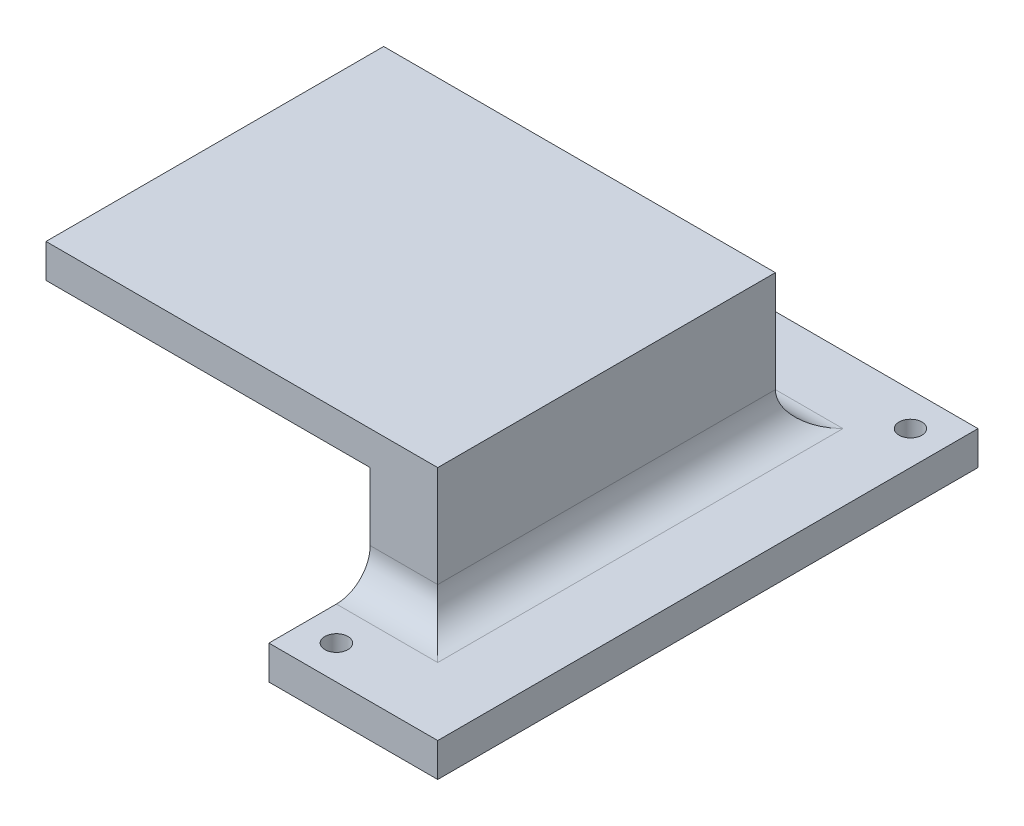
ISO-10303-21;
HEADER;
FILE_DESCRIPTION(('STEP AP214'),'2;1');
FILE_NAME('part.step','',(''),(''),'','','');
FILE_SCHEMA(('AUTOMOTIVE_DESIGN { 1 0 10303 214 1 1 1 1 }'));
ENDSEC;
DATA;
#1=APPLICATION_CONTEXT('core data for automotive mechanical design processes');
#2=APPLICATION_PROTOCOL_DEFINITION('international standard','automotive_design',2000,#1);
#3=PRODUCT_CONTEXT('',#1,'mechanical');
#4=PRODUCT('Part','Part','',(#3));
#5=PRODUCT_RELATED_PRODUCT_CATEGORY('part','',(#4));
#6=PRODUCT_DEFINITION_FORMATION('','',#4);
#7=PRODUCT_DEFINITION_CONTEXT('part definition',#1,'design');
#8=PRODUCT_DEFINITION('design','',#6,#7);
#9=PRODUCT_DEFINITION_SHAPE('','',#8);
#10=(LENGTH_UNIT() NAMED_UNIT(*) SI_UNIT(.MILLI.,.METRE.));
#11=(NAMED_UNIT(*) PLANE_ANGLE_UNIT() SI_UNIT($,.RADIAN.));
#12=(NAMED_UNIT(*) SI_UNIT($,.STERADIAN.) SOLID_ANGLE_UNIT());
#13=UNCERTAINTY_MEASURE_WITH_UNIT(LENGTH_MEASURE(1.E-05),#10,'distance_accuracy_value','');
#14=(GEOMETRIC_REPRESENTATION_CONTEXT(3) GLOBAL_UNCERTAINTY_ASSIGNED_CONTEXT((#13)) GLOBAL_UNIT_ASSIGNED_CONTEXT((#10,
#11,#12)) REPRESENTATION_CONTEXT('',''));
#15=CARTESIAN_POINT('',(0.,0.,0.));
#16=DIRECTION('',(0.,0.,1.));
#17=DIRECTION('',(1.,0.,0.));
#18=AXIS2_PLACEMENT_3D('',#15,#16,#17);
#19=CARTESIAN_POINT('',(24.,5.,0.));
#20=DIRECTION('',(-1.,0.,0.));
#21=DIRECTION('',(0.,0.,1.));
#22=AXIS2_PLACEMENT_3D('',#19,#20,#21);
#23=PLANE('',#22);
#24=DIRECTION('',(0.,0.,-1.));
#25=VECTOR('',#24,1.);
#26=CARTESIAN_POINT('',(24.,0.,0.));
#27=LINE('',#26,#25);
#28=CARTESIAN_POINT('',(24.,0.,-6.5));
#29=VERTEX_POINT('',#28);
#30=CARTESIAN_POINT('',(24.,0.,-27.5));
#31=VERTEX_POINT('',#30);
#32=EDGE_CURVE('E253',#29,#31,#27,.T.);
#33=ORIENTED_EDGE('',*,*,#32,.F.);
#34=DIRECTION('',(0.,-1.,0.));
#35=VECTOR('',#34,1.);
#36=CARTESIAN_POINT('',(24.,0.,-6.5));
#37=LINE('',#36,#35);
#38=CARTESIAN_POINT('',(24.,20.,-6.5));
#39=VERTEX_POINT('',#38);
#40=EDGE_CURVE('E182',#39,#29,#37,.T.);
#41=ORIENTED_EDGE('',*,*,#40,.F.);
#42=DIRECTION('',(0.,0.,1.));
#43=VECTOR('',#42,1.);
#44=CARTESIAN_POINT('',(24.,20.,0.));
#45=LINE('',#44,#43);
#46=CARTESIAN_POINT('',(24.,20.,-27.5));
#47=VERTEX_POINT('',#46);
#48=EDGE_CURVE('E212',#47,#39,#45,.T.);
#49=ORIENTED_EDGE('',*,*,#48,.F.);
#50=DIRECTION('',(0.,-1.,0.));
#51=VECTOR('',#50,1.);
#52=CARTESIAN_POINT('',(24.,5.,-27.5));
#53=LINE('',#52,#51);
#54=EDGE_CURVE('E282',#47,#31,#53,.T.);
#55=ORIENTED_EDGE('',*,*,#54,.T.);
#56=EDGE_LOOP('',(#33,#41,#49,#55));
#57=FACE_BOUND('',#56,.T.);
#58=ADVANCED_FACE('F35',(#57),#23,.T.);
#59=CARTESIAN_POINT('',(24.,20.,-1.5));
#60=VERTEX_POINT('',#59);
#61=CARTESIAN_POINT('',(24.,20.,12.5));
#62=VERTEX_POINT('',#61);
#63=EDGE_CURVE('E211',#60,#62,#45,.T.);
#64=ORIENTED_EDGE('',*,*,#63,.F.);
#65=DIRECTION('',(0.,1.,0.));
#66=VECTOR('',#65,1.);
#67=CARTESIAN_POINT('',(24.,0.,-1.5));
#68=LINE('',#67,#66);
#69=CARTESIAN_POINT('',(24.,0.,-1.5));
#70=VERTEX_POINT('',#69);
#71=EDGE_CURVE('E179',#70,#60,#68,.T.);
#72=ORIENTED_EDGE('',*,*,#71,.F.);
#73=CARTESIAN_POINT('',(24.,0.,27.5));
#74=VERTEX_POINT('',#73);
#75=EDGE_CURVE('E254',#74,#70,#27,.T.);
#76=ORIENTED_EDGE('',*,*,#75,.F.);
#77=DIRECTION('',(0.,-1.,0.));
#78=VECTOR('',#77,1.);
#79=CARTESIAN_POINT('',(24.,5.,27.5));
#80=LINE('',#79,#78);
#81=CARTESIAN_POINT('',(24.,5.,27.5));
#82=VERTEX_POINT('',#81);
#83=EDGE_CURVE('E280',#82,#74,#80,.T.);
#84=ORIENTED_EDGE('',*,*,#83,.F.);
#85=DIRECTION('',(0.,0.,-1.));
#86=VECTOR('',#85,1.);
#87=CARTESIAN_POINT('',(24.,5.,0.));
#88=LINE('',#87,#86);
#89=CARTESIAN_POINT('',(24.,5.,17.5));
#90=VERTEX_POINT('',#89);
#91=EDGE_CURVE('E229',#82,#90,#88,.T.);
#92=ORIENTED_EDGE('',*,*,#91,.T.);
#93=CARTESIAN_POINT('',(24.,10.,17.5));
#94=DIRECTION('',(-1.,0.,0.));
#95=DIRECTION('',(0.,0.,1.));
#96=AXIS2_PLACEMENT_3D('',#93,#94,#95);
#97=CIRCLE('',#96,5.);
#98=CARTESIAN_POINT('',(24.,10.,12.5));
#99=VERTEX_POINT('',#98);
#100=EDGE_CURVE('E11',#90,#99,#97,.F.);
#101=ORIENTED_EDGE('',*,*,#100,.T.);
#102=DIRECTION('',(0.,-1.,0.));
#103=VECTOR('',#102,1.);
#104=CARTESIAN_POINT('',(24.,20.,12.5));
#105=LINE('',#104,#103);
#106=EDGE_CURVE('E223',#62,#99,#105,.T.);
#107=ORIENTED_EDGE('',*,*,#106,.F.);
#108=EDGE_LOOP('',(#64,#72,#76,#84,#92,#101,#107));
#109=FACE_BOUND('',#108,.T.);
#110=ADVANCED_FACE('F334',(#109),#23,.T.);
#111=CARTESIAN_POINT('',(0.,20.,0.));
#112=DIRECTION('',(0.,1.,0.));
#113=DIRECTION('',(0.,0.,1.));
#114=AXIS2_PLACEMENT_3D('',#111,#112,#113);
#115=PLANE('',#114);
#116=DIRECTION('',(1.,0.,0.));
#117=VECTOR('',#116,1.);
#118=CARTESIAN_POINT('',(17.,20.,-6.5));
#119=LINE('',#118,#117);
#120=CARTESIAN_POINT('',(17.,20.,-6.5));
#121=VERTEX_POINT('',#120);
#122=EDGE_CURVE('E324',#121,#39,#119,.T.);
#123=ORIENTED_EDGE('',*,*,#122,.F.);
#124=DIRECTION('',(0.,0.,-1.));
#125=VECTOR('',#124,1.);
#126=CARTESIAN_POINT('',(17.,20.,-6.5));
#127=LINE('',#126,#125);
#128=CARTESIAN_POINT('',(17.,20.,-1.5));
#129=VERTEX_POINT('',#128);
#130=EDGE_CURVE('E176',#129,#121,#127,.T.);
#131=ORIENTED_EDGE('',*,*,#130,.F.);
#132=DIRECTION('',(1.,0.,0.));
#133=VECTOR('',#132,1.);
#134=CARTESIAN_POINT('',(17.,20.,-1.5));
#135=LINE('',#134,#133);
#136=EDGE_CURVE('E187',#129,#60,#135,.T.);
#137=ORIENTED_EDGE('',*,*,#136,.T.);
#138=ORIENTED_EDGE('',*,*,#63,.T.);
#139=DIRECTION('',(1.,0.,0.));
#140=VECTOR('',#139,1.);
#141=CARTESIAN_POINT('',(-24.,20.,12.5));
#142=LINE('',#141,#140);
#143=CARTESIAN_POINT('',(-24.,20.,12.5));
#144=VERTEX_POINT('',#143);
#145=EDGE_CURVE('E185',#144,#62,#142,.T.);
#146=ORIENTED_EDGE('',*,*,#145,.F.);
#147=DIRECTION('',(0.,0.,1.));
#148=VECTOR('',#147,1.);
#149=CARTESIAN_POINT('',(-24.,20.,-37.5));
#150=LINE('',#149,#148);
#151=CARTESIAN_POINT('',(-24.,20.,-27.5));
#152=VERTEX_POINT('',#151);
#153=EDGE_CURVE('E183',#152,#144,#150,.T.);
#154=ORIENTED_EDGE('',*,*,#153,.F.);
#155=DIRECTION('',(1.,0.,0.));
#156=VECTOR('',#155,1.);
#157=CARTESIAN_POINT('',(0.,20.,-27.5));
#158=LINE('',#157,#156);
#159=EDGE_CURVE('E208',#152,#47,#158,.T.);
#160=ORIENTED_EDGE('',*,*,#159,.T.);
#161=ORIENTED_EDGE('',*,*,#48,.T.);
#162=EDGE_LOOP('',(#123,#131,#137,#138,#146,#154,#160,#161));
#163=FACE_BOUND('',#162,.T.);
#164=ADVANCED_FACE('F331',(#163),#115,.F.);
#165=CARTESIAN_POINT('',(0.,5.,0.));
#166=DIRECTION('',(0.,1.,0.));
#167=DIRECTION('',(0.,0.,1.));
#168=AXIS2_PLACEMENT_3D('',#165,#166,#167);
#169=PLANE('',#168);
#170=DIRECTION('',(0.,0.,-1.));
#171=VECTOR('',#170,1.);
#172=CARTESIAN_POINT('',(-24.,5.,0.));
#173=LINE('',#172,#171);
#174=CARTESIAN_POINT('',(-24.,5.,-42.5));
#175=VERTEX_POINT('',#174);
#176=CARTESIAN_POINT('',(-24.,5.,-52.5));
#177=VERTEX_POINT('',#176);
#178=EDGE_CURVE('E239',#175,#177,#173,.T.);
#179=ORIENTED_EDGE('',*,*,#178,.F.);
#180=DIRECTION('',(1.,0.,0.));
#181=VECTOR('',#180,1.);
#182=CARTESIAN_POINT('',(34.,5.,-42.5));
#183=LINE('',#182,#181);
#184=CARTESIAN_POINT('',(39.,5.,-42.5));
#185=VERTEX_POINT('',#184);
#186=EDGE_CURVE('E289',#175,#185,#183,.T.);
#187=ORIENTED_EDGE('',*,*,#186,.T.);
#188=DIRECTION('',(0.,0.,-1.));
#189=VECTOR('',#188,1.);
#190=CARTESIAN_POINT('',(39.,5.,0.));
#191=LINE('',#190,#189);
#192=CARTESIAN_POINT('',(39.,5.,17.5));
#193=VERTEX_POINT('',#192);
#194=EDGE_CURVE('E285',#185,#193,#191,.F.);
#195=ORIENTED_EDGE('',*,*,#194,.T.);
#196=DIRECTION('',(-1.,0.,0.));
#197=VECTOR('',#196,1.);
#198=CARTESIAN_POINT('',(24.,5.,17.5));
#199=LINE('',#198,#197);
#200=EDGE_CURVE('E287',#193,#90,#199,.T.);
#201=ORIENTED_EDGE('',*,*,#200,.T.);
#202=ORIENTED_EDGE('',*,*,#91,.F.);
#203=DIRECTION('',(1.,0.,0.));
#204=VECTOR('',#203,1.);
#205=CARTESIAN_POINT('',(0.,5.,27.5));
#206=LINE('',#205,#204);
#207=CARTESIAN_POINT('',(49.,5.,27.5));
#208=VERTEX_POINT('',#207);
#209=EDGE_CURVE('E232',#82,#208,#206,.T.);
#210=ORIENTED_EDGE('',*,*,#209,.T.);
#211=DIRECTION('',(0.,0.,-1.));
#212=VECTOR('',#211,1.);
#213=CARTESIAN_POINT('',(49.,5.,0.));
#214=LINE('',#213,#212);
#215=CARTESIAN_POINT('',(49.,5.,-52.5));
#216=VERTEX_POINT('',#215);
#217=EDGE_CURVE('E234',#208,#216,#214,.T.);
#218=ORIENTED_EDGE('',*,*,#217,.T.);
#219=DIRECTION('',(1.,0.,0.));
#220=VECTOR('',#219,1.);
#221=CARTESIAN_POINT('',(0.,5.,-52.5));
#222=LINE('',#221,#220);
#223=EDGE_CURVE('E236',#177,#216,#222,.T.);
#224=ORIENTED_EDGE('',*,*,#223,.F.);
#225=EDGE_LOOP('',(#179,#187,#195,#201,#202,#210,#218,#224));
#226=FACE_BOUND('',#225,.T.);
#227=CARTESIAN_POINT('',(-19.,5.,-47.5));
#228=DIRECTION('',(0.,1.,0.));
#229=DIRECTION('',(0.,0.,1.));
#230=AXIS2_PLACEMENT_3D('',#227,#228,#229);
#231=CIRCLE('',#230,1.7);
#232=CARTESIAN_POINT('',(-19.,5.,-45.8));
#233=VERTEX_POINT('',#232);
#234=EDGE_CURVE('E226',#233,#233,#231,.T.);
#235=ORIENTED_EDGE('',*,*,#234,.F.);
#236=EDGE_LOOP('',(#235));
#237=FACE_BOUND('',#236,.T.);
#238=CARTESIAN_POINT('',(44.,5.,-47.5));
#239=DIRECTION('',(0.,1.,0.));
#240=DIRECTION('',(0.,0.,1.));
#241=AXIS2_PLACEMENT_3D('',#238,#239,#240);
#242=CIRCLE('',#241,1.7);
#243=CARTESIAN_POINT('',(44.,5.,-45.8));
#244=VERTEX_POINT('',#243);
#245=EDGE_CURVE('E241',#244,#244,#242,.T.);
#246=ORIENTED_EDGE('',*,*,#245,.F.);
#247=EDGE_LOOP('',(#246));
#248=FACE_BOUND('',#247,.T.);
#249=CARTESIAN_POINT('',(29.,5.,22.5));
#250=DIRECTION('',(0.,1.,0.));
#251=DIRECTION('',(0.,0.,1.));
#252=AXIS2_PLACEMENT_3D('',#249,#250,#251);
#253=CIRCLE('',#252,1.7);
#254=CARTESIAN_POINT('',(29.,5.,24.2));
#255=VERTEX_POINT('',#254);
#256=EDGE_CURVE('E244',#255,#255,#253,.T.);
#257=ORIENTED_EDGE('',*,*,#256,.F.);
#258=EDGE_LOOP('',(#257));
#259=FACE_BOUND('',#258,.T.);
#260=ADVANCED_FACE('F364',(#226,#237,#248,#259),#169,.T.);
#261=CARTESIAN_POINT('',(0.,5.,-27.5));
#262=DIRECTION('',(0.,0.,-1.));
#263=DIRECTION('',(-1.,0.,0.));
#264=AXIS2_PLACEMENT_3D('',#261,#262,#263);
#265=PLANE('',#264);
#266=DIRECTION('',(1.,0.,0.));
#267=VECTOR('',#266,1.);
#268=CARTESIAN_POINT('',(0.,0.,-27.5));
#269=LINE('',#268,#267);
#270=CARTESIAN_POINT('',(-24.,0.,-27.5));
#271=VERTEX_POINT('',#270);
#272=EDGE_CURVE('E250',#271,#31,#269,.T.);
#273=ORIENTED_EDGE('',*,*,#272,.T.);
#274=ORIENTED_EDGE('',*,*,#54,.F.);
#275=ORIENTED_EDGE('',*,*,#159,.F.);
#276=DIRECTION('',(0.,-1.,0.));
#277=VECTOR('',#276,1.);
#278=CARTESIAN_POINT('',(-24.,5.,-27.5));
#279=LINE('',#278,#277);
#280=EDGE_CURVE('E247',#152,#271,#279,.T.);
#281=ORIENTED_EDGE('',*,*,#280,.T.);
#282=EDGE_LOOP('',(#273,#274,#275,#281));
#283=FACE_BOUND('',#282,.T.);
#284=ADVANCED_FACE('F361',(#283),#265,.F.);
#285=CARTESIAN_POINT('',(0.,5.,27.5));
#286=DIRECTION('',(0.,0.,-1.));
#287=DIRECTION('',(-1.,0.,0.));
#288=AXIS2_PLACEMENT_3D('',#285,#286,#287);
#289=PLANE('',#288);
#290=DIRECTION('',(1.,0.,0.));
#291=VECTOR('',#290,1.);
#292=CARTESIAN_POINT('',(0.,0.,27.5));
#293=LINE('',#292,#291);
#294=CARTESIAN_POINT('',(49.,0.,27.5));
#295=VERTEX_POINT('',#294);
#296=EDGE_CURVE('E256',#74,#295,#293,.T.);
#297=ORIENTED_EDGE('',*,*,#296,.T.);
#298=DIRECTION('',(0.,-1.,0.));
#299=VECTOR('',#298,1.);
#300=CARTESIAN_POINT('',(49.,5.,27.5));
#301=LINE('',#300,#299);
#302=EDGE_CURVE('E277',#208,#295,#301,.T.);
#303=ORIENTED_EDGE('',*,*,#302,.F.);
#304=ORIENTED_EDGE('',*,*,#209,.F.);
#305=ORIENTED_EDGE('',*,*,#83,.T.);
#306=EDGE_LOOP('',(#297,#303,#304,#305));
#307=FACE_BOUND('',#306,.T.);
#308=ADVANCED_FACE('F359',(#307),#289,.F.);
#309=CARTESIAN_POINT('',(49.,5.,0.));
#310=DIRECTION('',(-1.,0.,0.));
#311=DIRECTION('',(0.,0.,1.));
#312=AXIS2_PLACEMENT_3D('',#309,#310,#311);
#313=PLANE('',#312);
#314=DIRECTION('',(0.,0.,-1.));
#315=VECTOR('',#314,1.);
#316=CARTESIAN_POINT('',(49.,0.,0.));
#317=LINE('',#316,#315);
#318=CARTESIAN_POINT('',(49.,0.,-52.5));
#319=VERTEX_POINT('',#318);
#320=EDGE_CURVE('E258',#295,#319,#317,.T.);
#321=ORIENTED_EDGE('',*,*,#320,.T.);
#322=DIRECTION('',(0.,-1.,0.));
#323=VECTOR('',#322,1.);
#324=CARTESIAN_POINT('',(49.,5.,-52.5));
#325=LINE('',#324,#323);
#326=EDGE_CURVE('E275',#216,#319,#325,.T.);
#327=ORIENTED_EDGE('',*,*,#326,.F.);
#328=ORIENTED_EDGE('',*,*,#217,.F.);
#329=ORIENTED_EDGE('',*,*,#302,.T.);
#330=EDGE_LOOP('',(#321,#327,#328,#329));
#331=FACE_BOUND('',#330,.T.);
#332=ADVANCED_FACE('F442',(#331),#313,.F.);
#333=CARTESIAN_POINT('',(0.,5.,-52.5));
#334=DIRECTION('',(0.,0.,-1.));
#335=DIRECTION('',(-1.,0.,0.));
#336=AXIS2_PLACEMENT_3D('',#333,#334,#335);
#337=PLANE('',#336);
#338=DIRECTION('',(1.,0.,0.));
#339=VECTOR('',#338,1.);
#340=CARTESIAN_POINT('',(0.,0.,-52.5));
#341=LINE('',#340,#339);
#342=CARTESIAN_POINT('',(-24.,0.,-52.5));
#343=VERTEX_POINT('',#342);
#344=EDGE_CURVE('E261',#343,#319,#341,.T.);
#345=ORIENTED_EDGE('',*,*,#344,.F.);
#346=DIRECTION('',(0.,-1.,0.));
#347=VECTOR('',#346,1.);
#348=CARTESIAN_POINT('',(-24.,5.,-52.5));
#349=LINE('',#348,#347);
#350=EDGE_CURVE('E273',#177,#343,#349,.T.);
#351=ORIENTED_EDGE('',*,*,#350,.F.);
#352=ORIENTED_EDGE('',*,*,#223,.T.);
#353=ORIENTED_EDGE('',*,*,#326,.T.);
#354=EDGE_LOOP('',(#345,#351,#352,#353));
#355=FACE_BOUND('',#354,.T.);
#356=ADVANCED_FACE('F406',(#355),#337,.T.);
#357=CARTESIAN_POINT('',(44.,5.,-47.5));
#358=DIRECTION('',(0.,-1.,0.));
#359=DIRECTION('',(0.,0.,-1.));
#360=AXIS2_PLACEMENT_3D('',#357,#358,#359);
#361=CYLINDRICAL_SURFACE('',#360,1.7);
#362=ORIENTED_EDGE('',*,*,#245,.T.);
#363=EDGE_LOOP('',(#362));
#364=FACE_BOUND('',#363,.T.);
#365=CARTESIAN_POINT('',(44.,0.,-47.5));
#366=DIRECTION('',(0.,1.,0.));
#367=DIRECTION('',(0.,0.,1.));
#368=AXIS2_PLACEMENT_3D('',#365,#366,#367);
#369=CIRCLE('',#368,1.7);
#370=CARTESIAN_POINT('',(44.,0.,-45.8));
#371=VERTEX_POINT('',#370);
#372=EDGE_CURVE('E267',#371,#371,#369,.T.);
#373=ORIENTED_EDGE('',*,*,#372,.F.);
#374=EDGE_LOOP('',(#373));
#375=FACE_BOUND('',#374,.T.);
#376=ADVANCED_FACE('F435',(#364,#375),#361,.F.);
#377=CARTESIAN_POINT('',(-24.,5.,0.));
#378=DIRECTION('',(-1.,0.,0.));
#379=DIRECTION('',(0.,0.,1.));
#380=AXIS2_PLACEMENT_3D('',#377,#378,#379);
#381=PLANE('',#380);
#382=DIRECTION('',(0.,0.,-1.));
#383=VECTOR('',#382,1.);
#384=CARTESIAN_POINT('',(-24.,0.,0.));
#385=LINE('',#384,#383);
#386=EDGE_CURVE('E264',#271,#343,#385,.T.);
#387=ORIENTED_EDGE('',*,*,#386,.F.);
#388=ORIENTED_EDGE('',*,*,#280,.F.);
#389=ORIENTED_EDGE('',*,*,#153,.T.);
#390=DIRECTION('',(0.,-1.,0.));
#391=VECTOR('',#390,1.);
#392=CARTESIAN_POINT('',(-24.,25.,12.5));
#393=LINE('',#392,#391);
#394=CARTESIAN_POINT('',(-24.,25.,12.5));
#395=VERTEX_POINT('',#394);
#396=EDGE_CURVE('E202',#395,#144,#393,.T.);
#397=ORIENTED_EDGE('',*,*,#396,.F.);
#398=DIRECTION('',(0.,0.,1.));
#399=VECTOR('',#398,1.);
#400=CARTESIAN_POINT('',(-24.,25.,-37.5));
#401=LINE('',#400,#399);
#402=CARTESIAN_POINT('',(-24.,25.,-37.5));
#403=VERTEX_POINT('',#402);
#404=EDGE_CURVE('E191',#403,#395,#401,.T.);
#405=ORIENTED_EDGE('',*,*,#404,.F.);
#406=DIRECTION('',(0.,-1.,0.));
#407=VECTOR('',#406,1.);
#408=CARTESIAN_POINT('',(-24.,20.,-37.5));
#409=LINE('',#408,#407);
#410=CARTESIAN_POINT('',(-24.,10.,-37.5));
#411=VERTEX_POINT('',#410);
#412=EDGE_CURVE('E215',#403,#411,#409,.T.);
#413=ORIENTED_EDGE('',*,*,#412,.T.);
#414=CARTESIAN_POINT('',(-24.,10.,-42.5));
#415=DIRECTION('',(-1.,0.,0.));
#416=DIRECTION('',(0.,0.,1.));
#417=AXIS2_PLACEMENT_3D('',#414,#415,#416);
#418=CIRCLE('',#417,5.);
#419=EDGE_CURVE('E44',#411,#175,#418,.F.);
#420=ORIENTED_EDGE('',*,*,#419,.T.);
#421=ORIENTED_EDGE('',*,*,#178,.T.);
#422=ORIENTED_EDGE('',*,*,#350,.T.);
#423=EDGE_LOOP('',(#387,#388,#389,#397,#405,#413,#420,#421,#422));
#424=FACE_BOUND('',#423,.T.);
#425=ADVANCED_FACE('F370',(#424),#381,.T.);
#426=CARTESIAN_POINT('',(-19.,5.,-47.5));
#427=DIRECTION('',(0.,-1.,0.));
#428=DIRECTION('',(0.,0.,-1.));
#429=AXIS2_PLACEMENT_3D('',#426,#427,#428);
#430=CYLINDRICAL_SURFACE('',#429,1.7);
#431=ORIENTED_EDGE('',*,*,#234,.T.);
#432=EDGE_LOOP('',(#431));
#433=FACE_BOUND('',#432,.T.);
#434=CARTESIAN_POINT('',(-19.,0.,-47.5));
#435=DIRECTION('',(0.,1.,0.));
#436=DIRECTION('',(0.,0.,1.));
#437=AXIS2_PLACEMENT_3D('',#434,#435,#436);
#438=CIRCLE('',#437,1.7);
#439=CARTESIAN_POINT('',(-19.,0.,-45.8));
#440=VERTEX_POINT('',#439);
#441=EDGE_CURVE('E225',#440,#440,#438,.T.);
#442=ORIENTED_EDGE('',*,*,#441,.F.);
#443=EDGE_LOOP('',(#442));
#444=FACE_BOUND('',#443,.T.);
#445=ADVANCED_FACE('F366',(#433,#444),#430,.F.);
#446=CARTESIAN_POINT('',(29.,5.,22.5));
#447=DIRECTION('',(0.,-1.,0.));
#448=DIRECTION('',(0.,0.,-1.));
#449=AXIS2_PLACEMENT_3D('',#446,#447,#448);
#450=CYLINDRICAL_SURFACE('',#449,1.7);
#451=ORIENTED_EDGE('',*,*,#256,.T.);
#452=EDGE_LOOP('',(#451));
#453=FACE_BOUND('',#452,.T.);
#454=CARTESIAN_POINT('',(29.,0.,22.5));
#455=DIRECTION('',(0.,1.,0.));
#456=DIRECTION('',(0.,0.,1.));
#457=AXIS2_PLACEMENT_3D('',#454,#455,#456);
#458=CIRCLE('',#457,1.7);
#459=CARTESIAN_POINT('',(29.,0.,24.2));
#460=VERTEX_POINT('',#459);
#461=EDGE_CURVE('E230',#460,#460,#458,.T.);
#462=ORIENTED_EDGE('',*,*,#461,.F.);
#463=EDGE_LOOP('',(#462));
#464=FACE_BOUND('',#463,.T.);
#465=ADVANCED_FACE('F369',(#453,#464),#450,.F.);
#466=CARTESIAN_POINT('',(0.,0.,0.));
#467=DIRECTION('',(0.,1.,0.));
#468=DIRECTION('',(0.,0.,1.));
#469=AXIS2_PLACEMENT_3D('',#466,#467,#468);
#470=PLANE('',#469);
#471=ORIENTED_EDGE('',*,*,#441,.T.);
#472=EDGE_LOOP('',(#471));
#473=FACE_BOUND('',#472,.T.);
#474=ORIENTED_EDGE('',*,*,#272,.F.);
#475=ORIENTED_EDGE('',*,*,#386,.T.);
#476=ORIENTED_EDGE('',*,*,#344,.T.);
#477=ORIENTED_EDGE('',*,*,#320,.F.);
#478=ORIENTED_EDGE('',*,*,#296,.F.);
#479=ORIENTED_EDGE('',*,*,#75,.T.);
#480=DIRECTION('',(1.,0.,0.));
#481=VECTOR('',#480,1.);
#482=CARTESIAN_POINT('',(17.,0.,-1.5));
#483=LINE('',#482,#481);
#484=CARTESIAN_POINT('',(17.,0.,-1.5));
#485=VERTEX_POINT('',#484);
#486=EDGE_CURVE('E166',#485,#70,#483,.T.);
#487=ORIENTED_EDGE('',*,*,#486,.F.);
#488=DIRECTION('',(0.,0.,1.));
#489=VECTOR('',#488,1.);
#490=CARTESIAN_POINT('',(17.,0.,-6.5));
#491=LINE('',#490,#489);
#492=CARTESIAN_POINT('',(17.,0.,-6.5));
#493=VERTEX_POINT('',#492);
#494=EDGE_CURVE('E156',#493,#485,#491,.T.);
#495=ORIENTED_EDGE('',*,*,#494,.F.);
#496=DIRECTION('',(1.,0.,0.));
#497=VECTOR('',#496,1.);
#498=CARTESIAN_POINT('',(17.,0.,-6.5));
#499=LINE('',#498,#497);
#500=EDGE_CURVE('E162',#493,#29,#499,.T.);
#501=ORIENTED_EDGE('',*,*,#500,.T.);
#502=ORIENTED_EDGE('',*,*,#32,.T.);
#503=EDGE_LOOP('',(#474,#475,#476,#477,#478,#479,#487,#495,#501,#502));
#504=FACE_BOUND('',#503,.T.);
#505=ORIENTED_EDGE('',*,*,#372,.T.);
#506=EDGE_LOOP('',(#505));
#507=FACE_BOUND('',#506,.T.);
#508=ORIENTED_EDGE('',*,*,#461,.T.);
#509=EDGE_LOOP('',(#508));
#510=FACE_BOUND('',#509,.T.);
#511=ADVANCED_FACE('F159',(#473,#504,#507,#510),#470,.F.);
#512=CARTESIAN_POINT('',(0.,20.,12.5));
#513=DIRECTION('',(0.,0.,1.));
#514=DIRECTION('',(1.,0.,0.));
#515=AXIS2_PLACEMENT_3D('',#512,#513,#514);
#516=PLANE('',#515);
#517=ORIENTED_EDGE('',*,*,#106,.T.);
#518=DIRECTION('',(-1.,0.,0.));
#519=VECTOR('',#518,1.);
#520=CARTESIAN_POINT('',(34.,10.,12.5));
#521=LINE('',#520,#519);
#522=CARTESIAN_POINT('',(34.,10.,12.5));
#523=VERTEX_POINT('',#522);
#524=EDGE_CURVE('E57',#99,#523,#521,.F.);
#525=ORIENTED_EDGE('',*,*,#524,.T.);
#526=DIRECTION('',(0.,-1.,0.));
#527=VECTOR('',#526,1.);
#528=CARTESIAN_POINT('',(34.,20.,12.5));
#529=LINE('',#528,#527);
#530=CARTESIAN_POINT('',(34.,25.,12.5));
#531=VERTEX_POINT('',#530);
#532=EDGE_CURVE('E221',#531,#523,#529,.T.);
#533=ORIENTED_EDGE('',*,*,#532,.F.);
#534=DIRECTION('',(1.,0.,0.));
#535=VECTOR('',#534,1.);
#536=CARTESIAN_POINT('',(-24.,25.,12.5));
#537=LINE('',#536,#535);
#538=EDGE_CURVE('E194',#395,#531,#537,.T.);
#539=ORIENTED_EDGE('',*,*,#538,.F.);
#540=ORIENTED_EDGE('',*,*,#396,.T.);
#541=ORIENTED_EDGE('',*,*,#145,.T.);
#542=EDGE_LOOP('',(#517,#525,#533,#539,#540,#541));
#543=FACE_BOUND('',#542,.T.);
#544=ADVANCED_FACE('F412',(#543),#516,.T.);
#545=CARTESIAN_POINT('',(34.,20.,0.));
#546=DIRECTION('',(-1.,0.,0.));
#547=DIRECTION('',(0.,0.,1.));
#548=AXIS2_PLACEMENT_3D('',#545,#546,#547);
#549=PLANE('',#548);
#550=ORIENTED_EDGE('',*,*,#532,.T.);
#551=DIRECTION('',(0.,0.,-1.));
#552=VECTOR('',#551,1.);
#553=CARTESIAN_POINT('',(34.,10.,0.));
#554=LINE('',#553,#552);
#555=CARTESIAN_POINT('',(34.,10.,-37.5));
#556=VERTEX_POINT('',#555);
#557=EDGE_CURVE('E295',#523,#556,#554,.T.);
#558=ORIENTED_EDGE('',*,*,#557,.T.);
#559=DIRECTION('',(0.,-1.,0.));
#560=VECTOR('',#559,1.);
#561=CARTESIAN_POINT('',(34.,20.,-37.5));
#562=LINE('',#561,#560);
#563=CARTESIAN_POINT('',(34.,25.,-37.5));
#564=VERTEX_POINT('',#563);
#565=EDGE_CURVE('E218',#564,#556,#562,.T.);
#566=ORIENTED_EDGE('',*,*,#565,.F.);
#567=DIRECTION('',(0.,0.,-1.));
#568=VECTOR('',#567,1.);
#569=CARTESIAN_POINT('',(34.,25.,-37.5));
#570=LINE('',#569,#568);
#571=EDGE_CURVE('E197',#531,#564,#570,.T.);
#572=ORIENTED_EDGE('',*,*,#571,.F.);
#573=EDGE_LOOP('',(#550,#558,#566,#572));
#574=FACE_BOUND('',#573,.T.);
#575=ADVANCED_FACE('F388',(#574),#549,.F.);
#576=CARTESIAN_POINT('',(0.,20.,-37.5));
#577=DIRECTION('',(0.,0.,-1.));
#578=DIRECTION('',(-1.,0.,0.));
#579=AXIS2_PLACEMENT_3D('',#576,#577,#578);
#580=PLANE('',#579);
#581=ORIENTED_EDGE('',*,*,#565,.T.);
#582=DIRECTION('',(1.,0.,0.));
#583=VECTOR('',#582,1.);
#584=CARTESIAN_POINT('',(-24.,10.,-37.5));
#585=LINE('',#584,#583);
#586=EDGE_CURVE('E292',#556,#411,#585,.F.);
#587=ORIENTED_EDGE('',*,*,#586,.T.);
#588=ORIENTED_EDGE('',*,*,#412,.F.);
#589=DIRECTION('',(-1.,0.,0.));
#590=VECTOR('',#589,1.);
#591=CARTESIAN_POINT('',(-24.,25.,-37.5));
#592=LINE('',#591,#590);
#593=EDGE_CURVE('E200',#564,#403,#592,.T.);
#594=ORIENTED_EDGE('',*,*,#593,.F.);
#595=EDGE_LOOP('',(#581,#587,#588,#594));
#596=FACE_BOUND('',#595,.T.);
#597=ADVANCED_FACE('F392',(#596),#580,.T.);
#598=CARTESIAN_POINT('',(0.,25.,0.));
#599=DIRECTION('',(0.,1.,0.));
#600=DIRECTION('',(0.,0.,1.));
#601=AXIS2_PLACEMENT_3D('',#598,#599,#600);
#602=PLANE('',#601);
#603=ORIENTED_EDGE('',*,*,#404,.T.);
#604=ORIENTED_EDGE('',*,*,#538,.T.);
#605=ORIENTED_EDGE('',*,*,#571,.T.);
#606=ORIENTED_EDGE('',*,*,#593,.T.);
#607=EDGE_LOOP('',(#603,#604,#605,#606));
#608=FACE_BOUND('',#607,.T.);
#609=ADVANCED_FACE('F346',(#608),#602,.T.);
#610=CARTESIAN_POINT('',(17.,0.,-6.5));
#611=DIRECTION('',(0.,0.,1.));
#612=DIRECTION('',(1.,0.,0.));
#613=AXIS2_PLACEMENT_3D('',#610,#611,#612);
#614=PLANE('',#613);
#615=CARTESIAN_POINT('',(20.65,15.,-6.5));
#616=DIRECTION('',(0.,0.,1.));
#617=DIRECTION('',(1.,0.,0.));
#618=AXIS2_PLACEMENT_3D('',#615,#616,#617);
#619=CIRCLE('',#618,1.35);
#620=CARTESIAN_POINT('',(22.,15.,-6.5));
#621=VERTEX_POINT('',#620);
#622=EDGE_CURVE('E319',#621,#621,#619,.T.);
#623=ORIENTED_EDGE('',*,*,#622,.T.);
#624=EDGE_LOOP('',(#623));
#625=FACE_BOUND('',#624,.T.);
#626=CARTESIAN_POINT('',(20.65,5.,-6.5));
#627=DIRECTION('',(0.,0.,1.));
#628=DIRECTION('',(1.,0.,0.));
#629=AXIS2_PLACEMENT_3D('',#626,#627,#628);
#630=CIRCLE('',#629,1.35);
#631=CARTESIAN_POINT('',(22.,5.,-6.5));
#632=VERTEX_POINT('',#631);
#633=EDGE_CURVE('E314',#632,#632,#630,.T.);
#634=ORIENTED_EDGE('',*,*,#633,.T.);
#635=EDGE_LOOP('',(#634));
#636=FACE_BOUND('',#635,.T.);
#637=ORIENTED_EDGE('',*,*,#40,.T.);
#638=ORIENTED_EDGE('',*,*,#500,.F.);
#639=DIRECTION('',(0.,-1.,0.));
#640=VECTOR('',#639,1.);
#641=CARTESIAN_POINT('',(17.,0.,-6.5));
#642=LINE('',#641,#640);
#643=EDGE_CURVE('E171',#121,#493,#642,.T.);
#644=ORIENTED_EDGE('',*,*,#643,.F.);
#645=ORIENTED_EDGE('',*,*,#122,.T.);
#646=EDGE_LOOP('',(#637,#638,#644,#645));
#647=FACE_BOUND('',#646,.T.);
#648=ADVANCED_FACE('F181',(#625,#636,#647),#614,.F.);
#649=CARTESIAN_POINT('',(17.,0.,-1.5));
#650=DIRECTION('',(0.,0.,-1.));
#651=DIRECTION('',(-1.,0.,0.));
#652=AXIS2_PLACEMENT_3D('',#649,#650,#651);
#653=PLANE('',#652);
#654=CARTESIAN_POINT('',(20.65,15.,-1.5));
#655=DIRECTION('',(0.,0.,1.));
#656=DIRECTION('',(1.,0.,0.));
#657=AXIS2_PLACEMENT_3D('',#654,#655,#656);
#658=CIRCLE('',#657,1.35);
#659=CARTESIAN_POINT('',(22.,15.,-1.5));
#660=VERTEX_POINT('',#659);
#661=EDGE_CURVE('E309',#660,#660,#658,.T.);
#662=ORIENTED_EDGE('',*,*,#661,.F.);
#663=EDGE_LOOP('',(#662));
#664=FACE_BOUND('',#663,.T.);
#665=CARTESIAN_POINT('',(20.65,5.,-1.5));
#666=DIRECTION('',(0.,0.,1.));
#667=DIRECTION('',(1.,0.,0.));
#668=AXIS2_PLACEMENT_3D('',#665,#666,#667);
#669=CIRCLE('',#668,1.35);
#670=CARTESIAN_POINT('',(22.,5.,-1.5));
#671=VERTEX_POINT('',#670);
#672=EDGE_CURVE('E304',#671,#671,#669,.T.);
#673=ORIENTED_EDGE('',*,*,#672,.F.);
#674=EDGE_LOOP('',(#673));
#675=FACE_BOUND('',#674,.T.);
#676=ORIENTED_EDGE('',*,*,#71,.T.);
#677=ORIENTED_EDGE('',*,*,#136,.F.);
#678=DIRECTION('',(0.,1.,0.));
#679=VECTOR('',#678,1.);
#680=CARTESIAN_POINT('',(17.,0.,-1.5));
#681=LINE('',#680,#679);
#682=EDGE_CURVE('E170',#485,#129,#681,.T.);
#683=ORIENTED_EDGE('',*,*,#682,.F.);
#684=ORIENTED_EDGE('',*,*,#486,.T.);
#685=EDGE_LOOP('',(#676,#677,#683,#684));
#686=FACE_BOUND('',#685,.T.);
#687=ADVANCED_FACE('F336',(#664,#675,#686),#653,.F.);
#688=CARTESIAN_POINT('',(17.,0.,0.));
#689=DIRECTION('',(1.,0.,0.));
#690=DIRECTION('',(0.,0.,-1.));
#691=AXIS2_PLACEMENT_3D('',#688,#689,#690);
#692=PLANE('',#691);
#693=ORIENTED_EDGE('',*,*,#643,.T.);
#694=ORIENTED_EDGE('',*,*,#494,.T.);
#695=ORIENTED_EDGE('',*,*,#682,.T.);
#696=ORIENTED_EDGE('',*,*,#130,.T.);
#697=EDGE_LOOP('',(#693,#694,#695,#696));
#698=FACE_BOUND('',#697,.T.);
#699=ADVANCED_FACE('F175',(#698),#692,.F.);
#700=CARTESIAN_POINT('',(20.65,5.,-9.5));
#701=DIRECTION('',(0.,0.,1.));
#702=DIRECTION('',(1.,0.,0.));
#703=AXIS2_PLACEMENT_3D('',#700,#701,#702);
#704=CYLINDRICAL_SURFACE('',#703,1.35);
#705=ORIENTED_EDGE('',*,*,#672,.T.);
#706=EDGE_LOOP('',(#705));
#707=FACE_BOUND('',#706,.T.);
#708=ORIENTED_EDGE('',*,*,#633,.F.);
#709=EDGE_LOOP('',(#708));
#710=FACE_BOUND('',#709,.T.);
#711=ADVANCED_FACE('F344',(#707,#710),#704,.F.);
#712=CARTESIAN_POINT('',(20.65,15.,-9.5));
#713=DIRECTION('',(0.,0.,1.));
#714=DIRECTION('',(1.,0.,0.));
#715=AXIS2_PLACEMENT_3D('',#712,#713,#714);
#716=CYLINDRICAL_SURFACE('',#715,1.35);
#717=ORIENTED_EDGE('',*,*,#661,.T.);
#718=EDGE_LOOP('',(#717));
#719=FACE_BOUND('',#718,.T.);
#720=ORIENTED_EDGE('',*,*,#622,.F.);
#721=EDGE_LOOP('',(#720));
#722=FACE_BOUND('',#721,.T.);
#723=ADVANCED_FACE('F379',(#719,#722),#716,.F.);
#724=CARTESIAN_POINT('',(0.,10.,17.5));
#725=DIRECTION('',(1.,0.,0.));
#726=DIRECTION('',(0.,0.,-1.));
#727=AXIS2_PLACEMENT_3D('',#724,#725,#726);
#728=CYLINDRICAL_SURFACE('',#727,5.);
#729=ORIENTED_EDGE('',*,*,#100,.F.);
#730=ORIENTED_EDGE('',*,*,#200,.F.);
#731=CARTESIAN_POINT('',(39.,10.,17.5));
#732=DIRECTION('',(0.707106781186547,0.,-0.707106781186548));
#733=DIRECTION('',(-0.707106781186548,0.,-0.707106781186547));
#734=AXIS2_PLACEMENT_3D('',#731,#732,#733);
#735=ELLIPSE('',#734,7.07106781186548,5.);
#736=EDGE_CURVE('E39',#523,#193,#735,.F.);
#737=ORIENTED_EDGE('',*,*,#736,.F.);
#738=ORIENTED_EDGE('',*,*,#524,.F.);
#739=EDGE_LOOP('',(#729,#730,#737,#738));
#740=FACE_BOUND('',#739,.T.);
#741=ADVANCED_FACE('F37',(#740),#728,.F.);
#742=CARTESIAN_POINT('',(39.,10.,0.));
#743=DIRECTION('',(0.,0.,-1.));
#744=DIRECTION('',(-1.,0.,0.));
#745=AXIS2_PLACEMENT_3D('',#742,#743,#744);
#746=CYLINDRICAL_SURFACE('',#745,5.);
#747=ORIENTED_EDGE('',*,*,#736,.T.);
#748=ORIENTED_EDGE('',*,*,#194,.F.);
#749=CARTESIAN_POINT('',(39.,10.,-42.5));
#750=DIRECTION('',(-0.707106781186548,0.,-0.707106781186547));
#751=DIRECTION('',(0.707106781186547,0.,-0.707106781186548));
#752=AXIS2_PLACEMENT_3D('',#749,#750,#751);
#753=ELLIPSE('',#752,7.07106781186547,5.);
#754=EDGE_CURVE('E297',#556,#185,#753,.F.);
#755=ORIENTED_EDGE('',*,*,#754,.F.);
#756=ORIENTED_EDGE('',*,*,#557,.F.);
#757=EDGE_LOOP('',(#747,#748,#755,#756));
#758=FACE_BOUND('',#757,.T.);
#759=ADVANCED_FACE('F374',(#758),#746,.F.);
#760=CARTESIAN_POINT('',(0.,10.,-42.5));
#761=DIRECTION('',(-1.,0.,0.));
#762=DIRECTION('',(0.,0.,1.));
#763=AXIS2_PLACEMENT_3D('',#760,#761,#762);
#764=CYLINDRICAL_SURFACE('',#763,5.);
#765=ORIENTED_EDGE('',*,*,#419,.F.);
#766=ORIENTED_EDGE('',*,*,#586,.F.);
#767=ORIENTED_EDGE('',*,*,#754,.T.);
#768=ORIENTED_EDGE('',*,*,#186,.F.);
#769=EDGE_LOOP('',(#765,#766,#767,#768));
#770=FACE_BOUND('',#769,.T.);
#771=ADVANCED_FACE('F372',(#770),#764,.F.);
#772=CLOSED_SHELL('',(#58,#110,#164,#260,#284,#308,#332,#356,#376,#425,#445,#465,#511,#544,#575,
#597,#609,#648,#687,#699,#711,#723,#741,#759,#771));
#773=MANIFOLD_SOLID_BREP('B2',#772);
#774=ADVANCED_BREP_SHAPE_REPRESENTATION('',(#18,#773),#14);
#775=SHAPE_DEFINITION_REPRESENTATION(#9,#774);
ENDSEC;
END-ISO-10303-21;
